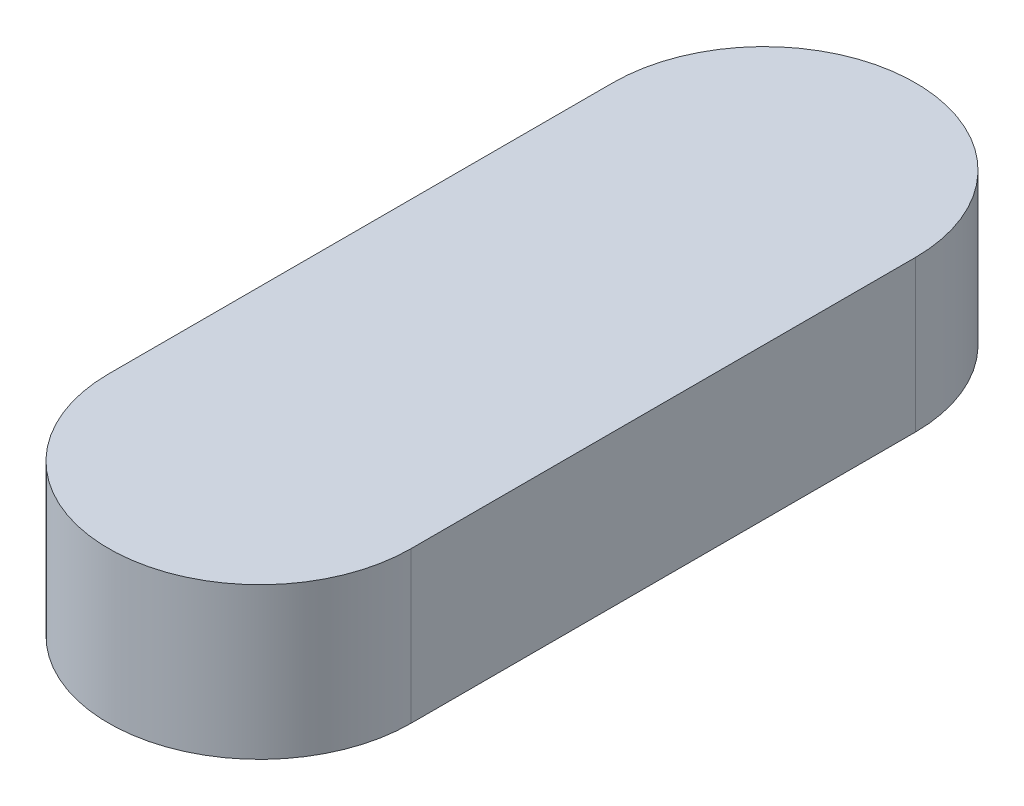
ISO-10303-21;
HEADER;
FILE_DESCRIPTION(('STEP AP214'),'2;1');
FILE_NAME('part.step','',(''),(''),'','','');
FILE_SCHEMA(('AUTOMOTIVE_DESIGN { 1 0 10303 214 1 1 1 1 }'));
ENDSEC;
DATA;
#1=APPLICATION_CONTEXT('core data for automotive mechanical design processes');
#2=APPLICATION_PROTOCOL_DEFINITION('international standard','automotive_design',2000,#1);
#3=PRODUCT_CONTEXT('',#1,'mechanical');
#4=PRODUCT('Part','Part','',(#3));
#5=PRODUCT_RELATED_PRODUCT_CATEGORY('part','',(#4));
#6=PRODUCT_DEFINITION_FORMATION('','',#4);
#7=PRODUCT_DEFINITION_CONTEXT('part definition',#1,'design');
#8=PRODUCT_DEFINITION('design','',#6,#7);
#9=PRODUCT_DEFINITION_SHAPE('','',#8);
#10=(LENGTH_UNIT() NAMED_UNIT(*) SI_UNIT(.MILLI.,.METRE.));
#11=(NAMED_UNIT(*) PLANE_ANGLE_UNIT() SI_UNIT($,.RADIAN.));
#12=(NAMED_UNIT(*) SI_UNIT($,.STERADIAN.) SOLID_ANGLE_UNIT());
#13=UNCERTAINTY_MEASURE_WITH_UNIT(LENGTH_MEASURE(1.E-05),#10,'distance_accuracy_value','');
#14=(GEOMETRIC_REPRESENTATION_CONTEXT(3) GLOBAL_UNCERTAINTY_ASSIGNED_CONTEXT((#13)) GLOBAL_UNIT_ASSIGNED_CONTEXT((#10,
#11,#12)) REPRESENTATION_CONTEXT('',''));
#15=CARTESIAN_POINT('',(0.,0.,0.));
#16=DIRECTION('',(0.,0.,1.));
#17=DIRECTION('',(1.,0.,0.));
#18=AXIS2_PLACEMENT_3D('',#15,#16,#17);
#19=CARTESIAN_POINT('',(0.,3.,0.));
#20=DIRECTION('',(0.,-1.,0.));
#21=DIRECTION('',(0.,0.,-1.));
#22=AXIS2_PLACEMENT_3D('',#19,#20,#21);
#23=CYLINDRICAL_SURFACE('',#22,3.);
#24=CARTESIAN_POINT('',(0.,0.,0.));
#25=DIRECTION('',(0.,1.,0.));
#26=DIRECTION('',(0.,0.,1.));
#27=AXIS2_PLACEMENT_3D('',#24,#25,#26);
#28=CIRCLE('',#27,3.);
#29=CARTESIAN_POINT('',(-3.,0.,0.));
#30=VERTEX_POINT('',#29);
#31=CARTESIAN_POINT('',(3.,0.,0.));
#32=VERTEX_POINT('',#31);
#33=EDGE_CURVE('E96',#30,#32,#28,.T.);
#34=ORIENTED_EDGE('',*,*,#33,.T.);
#35=DIRECTION('',(0.,-1.,0.));
#36=VECTOR('',#35,1.);
#37=CARTESIAN_POINT('',(3.,3.,0.));
#38=LINE('',#37,#36);
#39=CARTESIAN_POINT('',(3.,3.,0.));
#40=VERTEX_POINT('',#39);
#41=EDGE_CURVE('E11',#40,#32,#38,.T.);
#42=ORIENTED_EDGE('',*,*,#41,.F.);
#43=CARTESIAN_POINT('',(0.,3.,0.));
#44=DIRECTION('',(0.,1.,0.));
#45=DIRECTION('',(0.,0.,1.));
#46=AXIS2_PLACEMENT_3D('',#43,#44,#45);
#47=CIRCLE('',#46,3.);
#48=CARTESIAN_POINT('',(-3.,3.,0.));
#49=VERTEX_POINT('',#48);
#50=EDGE_CURVE('E84',#49,#40,#47,.T.);
#51=ORIENTED_EDGE('',*,*,#50,.F.);
#52=DIRECTION('',(0.,-1.,0.));
#53=VECTOR('',#52,1.);
#54=CARTESIAN_POINT('',(-3.,3.,0.));
#55=LINE('',#54,#53);
#56=EDGE_CURVE('E92',#49,#30,#55,.T.);
#57=ORIENTED_EDGE('',*,*,#56,.T.);
#58=EDGE_LOOP('',(#34,#42,#51,#57));
#59=FACE_BOUND('',#58,.T.);
#60=ADVANCED_FACE('F33',(#59),#23,.T.);
#61=CARTESIAN_POINT('',(3.,3.,0.));
#62=DIRECTION('',(-1.,0.,0.));
#63=DIRECTION('',(0.,0.,1.));
#64=AXIS2_PLACEMENT_3D('',#61,#62,#63);
#65=PLANE('',#64);
#66=DIRECTION('',(0.,0.,-1.));
#67=VECTOR('',#66,1.);
#68=CARTESIAN_POINT('',(3.,0.,0.));
#69=LINE('',#68,#67);
#70=CARTESIAN_POINT('',(3.,0.,-10.));
#71=VERTEX_POINT('',#70);
#72=EDGE_CURVE('E88',#32,#71,#69,.T.);
#73=ORIENTED_EDGE('',*,*,#72,.T.);
#74=DIRECTION('',(0.,-1.,0.));
#75=VECTOR('',#74,1.);
#76=CARTESIAN_POINT('',(3.,3.,-10.));
#77=LINE('',#76,#75);
#78=CARTESIAN_POINT('',(3.,3.,-10.));
#79=VERTEX_POINT('',#78);
#80=EDGE_CURVE('E41',#79,#71,#77,.T.);
#81=ORIENTED_EDGE('',*,*,#80,.F.);
#82=DIRECTION('',(0.,0.,-1.));
#83=VECTOR('',#82,1.);
#84=CARTESIAN_POINT('',(3.,3.,0.));
#85=LINE('',#84,#83);
#86=EDGE_CURVE('E79',#40,#79,#85,.T.);
#87=ORIENTED_EDGE('',*,*,#86,.F.);
#88=ORIENTED_EDGE('',*,*,#41,.T.);
#89=EDGE_LOOP('',(#73,#81,#87,#88));
#90=FACE_BOUND('',#89,.T.);
#91=ADVANCED_FACE('F87',(#90),#65,.F.);
#92=CARTESIAN_POINT('',(0.,3.,-10.));
#93=DIRECTION('',(0.,-1.,0.));
#94=DIRECTION('',(0.,0.,-1.));
#95=AXIS2_PLACEMENT_3D('',#92,#93,#94);
#96=CYLINDRICAL_SURFACE('',#95,3.);
#97=CARTESIAN_POINT('',(0.,0.,-10.));
#98=DIRECTION('',(0.,1.,0.));
#99=DIRECTION('',(0.,0.,1.));
#100=AXIS2_PLACEMENT_3D('',#97,#98,#99);
#101=CIRCLE('',#100,3.);
#102=CARTESIAN_POINT('',(-3.,0.,-10.));
#103=VERTEX_POINT('',#102);
#104=EDGE_CURVE('E66',#71,#103,#101,.T.);
#105=ORIENTED_EDGE('',*,*,#104,.T.);
#106=DIRECTION('',(0.,-1.,0.));
#107=VECTOR('',#106,1.);
#108=CARTESIAN_POINT('',(-3.,3.,-10.));
#109=LINE('',#108,#107);
#110=CARTESIAN_POINT('',(-3.,3.,-10.));
#111=VERTEX_POINT('',#110);
#112=EDGE_CURVE('E89',#111,#103,#109,.T.);
#113=ORIENTED_EDGE('',*,*,#112,.F.);
#114=CARTESIAN_POINT('',(0.,3.,-10.));
#115=DIRECTION('',(0.,1.,0.));
#116=DIRECTION('',(0.,0.,1.));
#117=AXIS2_PLACEMENT_3D('',#114,#115,#116);
#118=CIRCLE('',#117,3.);
#119=EDGE_CURVE('E82',#79,#111,#118,.T.);
#120=ORIENTED_EDGE('',*,*,#119,.F.);
#121=ORIENTED_EDGE('',*,*,#80,.T.);
#122=EDGE_LOOP('',(#105,#113,#120,#121));
#123=FACE_BOUND('',#122,.T.);
#124=ADVANCED_FACE('F90',(#123),#96,.T.);
#125=CARTESIAN_POINT('',(-3.,3.,0.));
#126=DIRECTION('',(1.,0.,0.));
#127=DIRECTION('',(0.,0.,-1.));
#128=AXIS2_PLACEMENT_3D('',#125,#126,#127);
#129=PLANE('',#128);
#130=DIRECTION('',(0.,0.,1.));
#131=VECTOR('',#130,1.);
#132=CARTESIAN_POINT('',(-3.,0.,0.));
#133=LINE('',#132,#131);
#134=EDGE_CURVE('E72',#103,#30,#133,.T.);
#135=ORIENTED_EDGE('',*,*,#134,.T.);
#136=ORIENTED_EDGE('',*,*,#56,.F.);
#137=DIRECTION('',(0.,0.,1.));
#138=VECTOR('',#137,1.);
#139=CARTESIAN_POINT('',(-3.,3.,0.));
#140=LINE('',#139,#138);
#141=EDGE_CURVE('E49',#111,#49,#140,.T.);
#142=ORIENTED_EDGE('',*,*,#141,.F.);
#143=ORIENTED_EDGE('',*,*,#112,.T.);
#144=EDGE_LOOP('',(#135,#136,#142,#143));
#145=FACE_BOUND('',#144,.T.);
#146=ADVANCED_FACE('F103',(#145),#129,.F.);
#147=CARTESIAN_POINT('',(0.,3.,0.));
#148=DIRECTION('',(0.,1.,0.));
#149=DIRECTION('',(0.,0.,1.));
#150=AXIS2_PLACEMENT_3D('',#147,#148,#149);
#151=PLANE('',#150);
#152=ORIENTED_EDGE('',*,*,#50,.T.);
#153=ORIENTED_EDGE('',*,*,#86,.T.);
#154=ORIENTED_EDGE('',*,*,#119,.T.);
#155=ORIENTED_EDGE('',*,*,#141,.T.);
#156=EDGE_LOOP('',(#152,#153,#154,#155));
#157=FACE_BOUND('',#156,.T.);
#158=ADVANCED_FACE('F80',(#157),#151,.T.);
#159=CARTESIAN_POINT('',(0.,0.,0.));
#160=DIRECTION('',(0.,1.,0.));
#161=DIRECTION('',(0.,0.,1.));
#162=AXIS2_PLACEMENT_3D('',#159,#160,#161);
#163=PLANE('',#162);
#164=ORIENTED_EDGE('',*,*,#33,.F.);
#165=ORIENTED_EDGE('',*,*,#134,.F.);
#166=ORIENTED_EDGE('',*,*,#104,.F.);
#167=ORIENTED_EDGE('',*,*,#72,.F.);
#168=EDGE_LOOP('',(#164,#165,#166,#167));
#169=FACE_BOUND('',#168,.T.);
#170=ADVANCED_FACE('F106',(#169),#163,.F.);
#171=CLOSED_SHELL('',(#60,#91,#124,#146,#158,#170));
#172=MANIFOLD_SOLID_BREP('B2',#171);
#173=ADVANCED_BREP_SHAPE_REPRESENTATION('',(#18,#172),#14);
#174=SHAPE_DEFINITION_REPRESENTATION(#9,#173);
ENDSEC;
END-ISO-10303-21;
